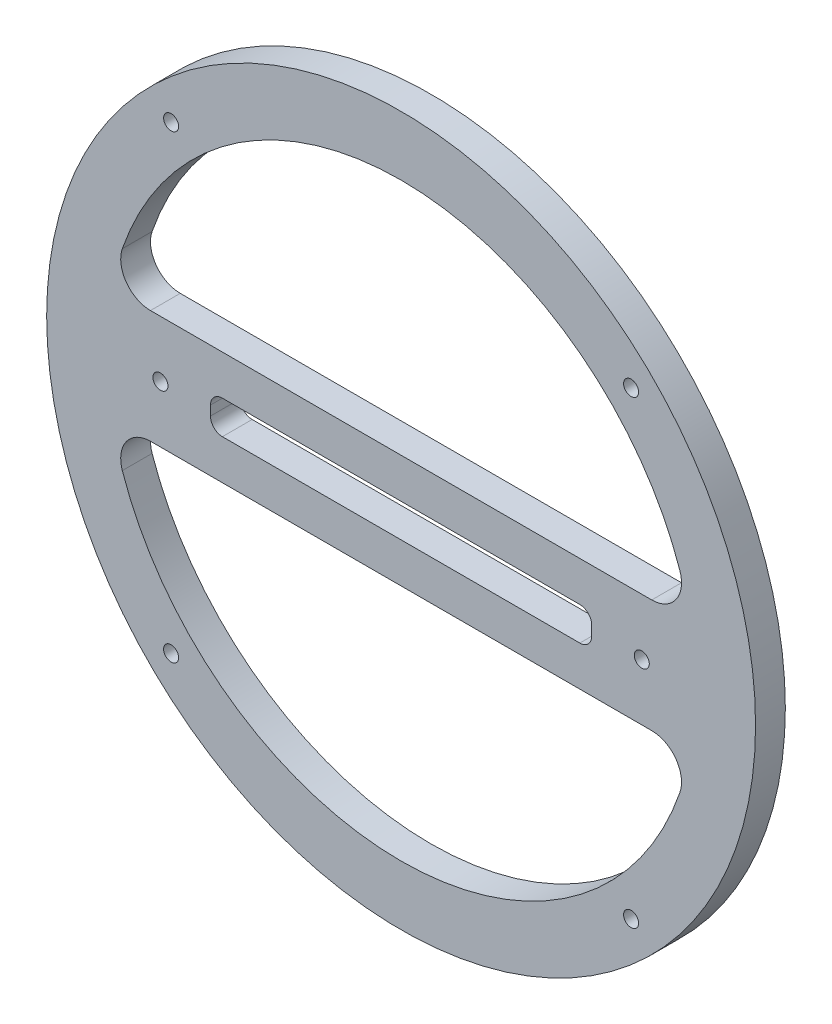
ISO-10303-21;
HEADER;
FILE_DESCRIPTION(('STEP AP214'),'2;1');
FILE_NAME('part.step','',(''),(''),'','','');
FILE_SCHEMA(('AUTOMOTIVE_DESIGN { 1 0 10303 214 1 1 1 1 }'));
ENDSEC;
DATA;
#1=APPLICATION_CONTEXT('core data for automotive mechanical design processes');
#2=APPLICATION_PROTOCOL_DEFINITION('international standard','automotive_design',2000,#1);
#3=PRODUCT_CONTEXT('',#1,'mechanical');
#4=PRODUCT('Part','Part','',(#3));
#5=PRODUCT_RELATED_PRODUCT_CATEGORY('part','',(#4));
#6=PRODUCT_DEFINITION_FORMATION('','',#4);
#7=PRODUCT_DEFINITION_CONTEXT('part definition',#1,'design');
#8=PRODUCT_DEFINITION('design','',#6,#7);
#9=PRODUCT_DEFINITION_SHAPE('','',#8);
#10=(LENGTH_UNIT() NAMED_UNIT(*) SI_UNIT(.MILLI.,.METRE.));
#11=(NAMED_UNIT(*) PLANE_ANGLE_UNIT() SI_UNIT($,.RADIAN.));
#12=(NAMED_UNIT(*) SI_UNIT($,.STERADIAN.) SOLID_ANGLE_UNIT());
#13=UNCERTAINTY_MEASURE_WITH_UNIT(LENGTH_MEASURE(1.E-05),#10,'distance_accuracy_value','');
#14=(GEOMETRIC_REPRESENTATION_CONTEXT(3) GLOBAL_UNCERTAINTY_ASSIGNED_CONTEXT((#13)) GLOBAL_UNIT_ASSIGNED_CONTEXT((#10,
#11,#12)) REPRESENTATION_CONTEXT('',''));
#15=CARTESIAN_POINT('',(0.,0.,0.));
#16=DIRECTION('',(0.,0.,1.));
#17=DIRECTION('',(1.,0.,0.));
#18=AXIS2_PLACEMENT_3D('',#15,#16,#17);
#19=CARTESIAN_POINT('',(0.,0.,-6.35));
#20=DIRECTION('',(0.,0.,1.));
#21=DIRECTION('',(1.,0.,0.));
#22=AXIS2_PLACEMENT_3D('',#19,#20,#21);
#23=CYLINDRICAL_SURFACE('',#22,75.565);
#24=CARTESIAN_POINT('',(0.,0.,-6.35));
#25=DIRECTION('',(0.,0.,1.));
#26=DIRECTION('',(1.,0.,0.));
#27=AXIS2_PLACEMENT_3D('',#24,#25,#26);
#28=CIRCLE('',#27,75.565);
#29=CARTESIAN_POINT('',(75.565,0.,-6.35));
#30=VERTEX_POINT('',#29);
#31=EDGE_CURVE('E11',#30,#30,#28,.T.);
#32=ORIENTED_EDGE('',*,*,#31,.T.);
#33=EDGE_LOOP('',(#32));
#34=FACE_BOUND('',#33,.T.);
#35=CARTESIAN_POINT('',(0.,0.,0.));
#36=DIRECTION('',(0.,0.,1.));
#37=DIRECTION('',(1.,0.,0.));
#38=AXIS2_PLACEMENT_3D('',#35,#36,#37);
#39=CIRCLE('',#38,75.565);
#40=CARTESIAN_POINT('',(75.565,0.,0.));
#41=VERTEX_POINT('',#40);
#42=EDGE_CURVE('E42',#41,#41,#39,.T.);
#43=ORIENTED_EDGE('',*,*,#42,.F.);
#44=EDGE_LOOP('',(#43));
#45=FACE_BOUND('',#44,.T.);
#46=ADVANCED_FACE('F39',(#34,#45),#23,.T.);
#47=CARTESIAN_POINT('',(0.,0.,-6.35));
#48=DIRECTION('',(0.,0.,1.));
#49=DIRECTION('',(1.,0.,0.));
#50=AXIS2_PLACEMENT_3D('',#47,#48,#49);
#51=PLANE('',#50);
#52=CARTESIAN_POINT('',(-49.0321984210441,49.0321984210295,-6.35));
#53=DIRECTION('',(0.,0.,1.));
#54=DIRECTION('',(1.,0.,0.));
#55=AXIS2_PLACEMENT_3D('',#52,#53,#54);
#56=CIRCLE('',#55,1.6);
#57=CARTESIAN_POINT('',(-47.4321984210441,49.0321984210295,-6.35));
#58=VERTEX_POINT('',#57);
#59=EDGE_CURVE('E460',#58,#58,#56,.T.);
#60=ORIENTED_EDGE('',*,*,#59,.T.);
#61=EDGE_LOOP('',(#60));
#62=FACE_BOUND('',#61,.T.);
#63=CARTESIAN_POINT('',(-49.0321984210294,-49.0321984210469,-6.35));
#64=DIRECTION('',(0.,0.,1.));
#65=DIRECTION('',(1.,0.,0.));
#66=AXIS2_PLACEMENT_3D('',#63,#64,#65);
#67=CIRCLE('',#66,1.6);
#68=CARTESIAN_POINT('',(-47.4321984210294,-49.0321984210469,-6.35));
#69=VERTEX_POINT('',#68);
#70=EDGE_CURVE('E469',#69,#69,#67,.T.);
#71=ORIENTED_EDGE('',*,*,#70,.T.);
#72=EDGE_LOOP('',(#71));
#73=FACE_BOUND('',#72,.T.);
#74=CARTESIAN_POINT('',(49.0321984210469,-49.0321984210322,-6.35));
#75=DIRECTION('',(0.,0.,1.));
#76=DIRECTION('',(1.,0.,0.));
#77=AXIS2_PLACEMENT_3D('',#74,#75,#76);
#78=CIRCLE('',#77,1.6);
#79=CARTESIAN_POINT('',(50.6321984210469,-49.0321984210322,-6.35));
#80=VERTEX_POINT('',#79);
#81=EDGE_CURVE('E477',#80,#80,#78,.T.);
#82=ORIENTED_EDGE('',*,*,#81,.T.);
#83=EDGE_LOOP('',(#82));
#84=FACE_BOUND('',#83,.T.);
#85=CARTESIAN_POINT('',(49.0321984210322,49.0321984210442,-6.35));
#86=DIRECTION('',(0.,0.,1.));
#87=DIRECTION('',(1.,0.,0.));
#88=AXIS2_PLACEMENT_3D('',#85,#86,#87);
#89=CIRCLE('',#88,1.6);
#90=CARTESIAN_POINT('',(50.6321984210322,49.0321984210442,-6.35));
#91=VERTEX_POINT('',#90);
#92=EDGE_CURVE('E485',#91,#91,#89,.T.);
#93=ORIENTED_EDGE('',*,*,#92,.T.);
#94=EDGE_LOOP('',(#93));
#95=FACE_BOUND('',#94,.T.);
#96=CARTESIAN_POINT('',(51.308,0.,-6.35));
#97=DIRECTION('',(0.,0.,1.));
#98=DIRECTION('',(-1.,0.,0.));
#99=AXIS2_PLACEMENT_3D('',#96,#97,#98);
#100=CIRCLE('',#99,1.6);
#101=CARTESIAN_POINT('',(49.708,0.,-6.35));
#102=VERTEX_POINT('',#101);
#103=EDGE_CURVE('E493',#102,#102,#100,.T.);
#104=ORIENTED_EDGE('',*,*,#103,.T.);
#105=EDGE_LOOP('',(#104));
#106=FACE_BOUND('',#105,.T.);
#107=CARTESIAN_POINT('',(-51.308,0.,-6.35));
#108=DIRECTION('',(0.,0.,1.));
#109=DIRECTION('',(1.,0.,0.));
#110=AXIS2_PLACEMENT_3D('',#107,#108,#109);
#111=CIRCLE('',#110,1.6);
#112=CARTESIAN_POINT('',(-49.708,0.,-6.35));
#113=VERTEX_POINT('',#112);
#114=EDGE_CURVE('E206',#113,#113,#111,.T.);
#115=ORIENTED_EDGE('',*,*,#114,.T.);
#116=EDGE_LOOP('',(#115));
#117=FACE_BOUND('',#116,.T.);
#118=DIRECTION('',(1.,0.,0.));
#119=VECTOR('',#118,1.);
#120=CARTESIAN_POINT('',(-38.1,-3.556,-6.35));
#121=LINE('',#120,#119);
#122=CARTESIAN_POINT('',(-38.1,-3.556,-6.35));
#123=VERTEX_POINT('',#122);
#124=CARTESIAN_POINT('',(38.1,-3.556,-6.35));
#125=VERTEX_POINT('',#124);
#126=EDGE_CURVE('E161',#123,#125,#121,.T.);
#127=ORIENTED_EDGE('',*,*,#126,.T.);
#128=CARTESIAN_POINT('',(38.1,-1.016,-6.35));
#129=DIRECTION('',(0.,0.,1.));
#130=DIRECTION('',(1.,0.,0.));
#131=AXIS2_PLACEMENT_3D('',#128,#129,#130);
#132=CIRCLE('',#131,2.54);
#133=CARTESIAN_POINT('',(40.64,-1.016,-6.35));
#134=VERTEX_POINT('',#133);
#135=EDGE_CURVE('E154',#125,#134,#132,.T.);
#136=ORIENTED_EDGE('',*,*,#135,.T.);
#137=DIRECTION('',(0.,1.,0.));
#138=VECTOR('',#137,1.);
#139=CARTESIAN_POINT('',(40.64,-1.016,-6.35));
#140=LINE('',#139,#138);
#141=CARTESIAN_POINT('',(40.64,1.016,-6.35));
#142=VERTEX_POINT('',#141);
#143=EDGE_CURVE('E164',#134,#142,#140,.T.);
#144=ORIENTED_EDGE('',*,*,#143,.T.);
#145=CARTESIAN_POINT('',(38.1,1.016,-6.35));
#146=DIRECTION('',(0.,0.,1.));
#147=DIRECTION('',(-1.,0.,0.));
#148=AXIS2_PLACEMENT_3D('',#145,#146,#147);
#149=CIRCLE('',#148,2.54);
#150=CARTESIAN_POINT('',(38.1,3.556,-6.35));
#151=VERTEX_POINT('',#150);
#152=EDGE_CURVE('E54',#142,#151,#149,.T.);
#153=ORIENTED_EDGE('',*,*,#152,.T.);
#154=DIRECTION('',(-1.,0.,0.));
#155=VECTOR('',#154,1.);
#156=CARTESIAN_POINT('',(-38.1,3.556,-6.35));
#157=LINE('',#156,#155);
#158=CARTESIAN_POINT('',(-38.1,3.556,-6.35));
#159=VERTEX_POINT('',#158);
#160=EDGE_CURVE('E186',#151,#159,#157,.T.);
#161=ORIENTED_EDGE('',*,*,#160,.T.);
#162=CARTESIAN_POINT('',(-38.1,1.016,-6.35));
#163=DIRECTION('',(0.,0.,1.));
#164=DIRECTION('',(-1.,0.,0.));
#165=AXIS2_PLACEMENT_3D('',#162,#163,#164);
#166=CIRCLE('',#165,2.54);
#167=CARTESIAN_POINT('',(-40.64,1.016,-6.35));
#168=VERTEX_POINT('',#167);
#169=EDGE_CURVE('E190',#159,#168,#166,.T.);
#170=ORIENTED_EDGE('',*,*,#169,.T.);
#171=DIRECTION('',(0.,-1.,0.));
#172=VECTOR('',#171,1.);
#173=CARTESIAN_POINT('',(-40.64,-1.016,-6.35));
#174=LINE('',#173,#172);
#175=CARTESIAN_POINT('',(-40.64,-1.016,-6.35));
#176=VERTEX_POINT('',#175);
#177=EDGE_CURVE('E194',#168,#176,#174,.T.);
#178=ORIENTED_EDGE('',*,*,#177,.T.);
#179=CARTESIAN_POINT('',(-38.1,-1.016,-6.35));
#180=DIRECTION('',(0.,0.,1.));
#181=DIRECTION('',(-1.,0.,0.));
#182=AXIS2_PLACEMENT_3D('',#179,#180,#181);
#183=CIRCLE('',#182,2.54);
#184=EDGE_CURVE('E198',#176,#123,#183,.T.);
#185=ORIENTED_EDGE('',*,*,#184,.T.);
#186=EDGE_LOOP('',(#127,#136,#144,#153,#161,#170,#178,#185));
#187=FACE_BOUND('',#186,.T.);
#188=DIRECTION('',(1.,0.,0.));
#189=VECTOR('',#188,1.);
#190=CARTESIAN_POINT('',(-53.4306372786251,12.065,-6.35));
#191=LINE('',#190,#189);
#192=CARTESIAN_POINT('',(-53.4306372786251,12.065,-6.35));
#193=VERTEX_POINT('',#192);
#194=CARTESIAN_POINT('',(53.4306372786251,12.065,-6.35));
#195=VERTEX_POINT('',#194);
#196=EDGE_CURVE('E262',#193,#195,#191,.T.);
#197=ORIENTED_EDGE('',*,*,#196,.T.);
#198=CARTESIAN_POINT('',(53.4306372786251,18.415,-6.35));
#199=DIRECTION('',(0.,0.,1.));
#200=DIRECTION('',(1.,0.,0.));
#201=AXIS2_PLACEMENT_3D('',#198,#199,#200);
#202=CIRCLE('',#201,6.35);
#203=CARTESIAN_POINT('',(59.4340796694818,20.4841011235955,-6.35));
#204=VERTEX_POINT('',#203);
#205=EDGE_CURVE('E249',#195,#204,#202,.T.);
#206=ORIENTED_EDGE('',*,*,#205,.T.);
#207=CARTESIAN_POINT('',(0.,0.,-6.35));
#208=DIRECTION('',(0.,0.,1.));
#209=DIRECTION('',(1.,0.,0.));
#210=AXIS2_PLACEMENT_3D('',#207,#208,#209);
#211=CIRCLE('',#210,62.865);
#212=CARTESIAN_POINT('',(-59.4340796694818,20.4841011235955,-6.35));
#213=VERTEX_POINT('',#212);
#214=EDGE_CURVE('E253',#204,#213,#211,.T.);
#215=ORIENTED_EDGE('',*,*,#214,.T.);
#216=CARTESIAN_POINT('',(-53.4306372786251,18.415,-6.35));
#217=DIRECTION('',(0.,0.,1.));
#218=DIRECTION('',(-1.,0.,0.));
#219=AXIS2_PLACEMENT_3D('',#216,#217,#218);
#220=CIRCLE('',#219,6.34999999999999);
#221=EDGE_CURVE('E258',#213,#193,#220,.T.);
#222=ORIENTED_EDGE('',*,*,#221,.T.);
#223=EDGE_LOOP('',(#197,#206,#215,#222));
#224=FACE_BOUND('',#223,.T.);
#225=DIRECTION('',(-1.,0.,0.));
#226=VECTOR('',#225,1.);
#227=CARTESIAN_POINT('',(-53.4306372786251,-12.065,-6.35));
#228=LINE('',#227,#226);
#229=CARTESIAN_POINT('',(53.4306372786251,-12.065,-6.35));
#230=VERTEX_POINT('',#229);
#231=CARTESIAN_POINT('',(-53.4306372786251,-12.065,-6.35));
#232=VERTEX_POINT('',#231);
#233=EDGE_CURVE('E306',#230,#232,#228,.T.);
#234=ORIENTED_EDGE('',*,*,#233,.T.);
#235=CARTESIAN_POINT('',(-53.4306372786251,-18.415,-6.35));
#236=DIRECTION('',(0.,0.,1.));
#237=DIRECTION('',(1.,0.,0.));
#238=AXIS2_PLACEMENT_3D('',#235,#236,#237);
#239=CIRCLE('',#238,6.34999999999999);
#240=CARTESIAN_POINT('',(-59.4340796694818,-20.4841011235955,-6.35));
#241=VERTEX_POINT('',#240);
#242=EDGE_CURVE('E293',#232,#241,#239,.T.);
#243=ORIENTED_EDGE('',*,*,#242,.T.);
#244=CARTESIAN_POINT('',(0.,0.,-6.35));
#245=DIRECTION('',(0.,0.,1.));
#246=DIRECTION('',(1.,0.,0.));
#247=AXIS2_PLACEMENT_3D('',#244,#245,#246);
#248=CIRCLE('',#247,62.865);
#249=CARTESIAN_POINT('',(59.4340796694818,-20.4841011235955,-6.35));
#250=VERTEX_POINT('',#249);
#251=EDGE_CURVE('E297',#241,#250,#248,.T.);
#252=ORIENTED_EDGE('',*,*,#251,.T.);
#253=CARTESIAN_POINT('',(53.4306372786251,-18.415,-6.35));
#254=DIRECTION('',(0.,0.,1.));
#255=DIRECTION('',(-1.,0.,0.));
#256=AXIS2_PLACEMENT_3D('',#253,#254,#255);
#257=CIRCLE('',#256,6.35);
#258=EDGE_CURVE('E302',#250,#230,#257,.T.);
#259=ORIENTED_EDGE('',*,*,#258,.T.);
#260=EDGE_LOOP('',(#234,#243,#252,#259));
#261=FACE_BOUND('',#260,.T.);
#262=ORIENTED_EDGE('',*,*,#31,.F.);
#263=EDGE_LOOP('',(#262));
#264=FACE_BOUND('',#263,.T.);
#265=ADVANCED_FACE('F169',(#62,#73,#84,#95,#106,#117,#187,#224,#261,#264),#51,.F.);
#266=CARTESIAN_POINT('',(0.,0.,0.));
#267=DIRECTION('',(0.,0.,1.));
#268=DIRECTION('',(1.,0.,0.));
#269=AXIS2_PLACEMENT_3D('',#266,#267,#268);
#270=PLANE('',#269);
#271=CARTESIAN_POINT('',(-49.0321984210441,49.0321984210295,0.));
#272=DIRECTION('',(0.,0.,1.));
#273=DIRECTION('',(1.,0.,0.));
#274=AXIS2_PLACEMENT_3D('',#271,#272,#273);
#275=CIRCLE('',#274,1.6);
#276=CARTESIAN_POINT('',(-47.4321984210441,49.0321984210295,0.));
#277=VERTEX_POINT('',#276);
#278=EDGE_CURVE('E462',#277,#277,#275,.T.);
#279=ORIENTED_EDGE('',*,*,#278,.F.);
#280=EDGE_LOOP('',(#279));
#281=FACE_BOUND('',#280,.T.);
#282=CARTESIAN_POINT('',(-49.0321984210294,-49.0321984210469,0.));
#283=DIRECTION('',(0.,0.,1.));
#284=DIRECTION('',(1.,0.,0.));
#285=AXIS2_PLACEMENT_3D('',#282,#283,#284);
#286=CIRCLE('',#285,1.6);
#287=CARTESIAN_POINT('',(-47.4321984210294,-49.0321984210469,0.));
#288=VERTEX_POINT('',#287);
#289=EDGE_CURVE('E466',#288,#288,#286,.T.);
#290=ORIENTED_EDGE('',*,*,#289,.F.);
#291=EDGE_LOOP('',(#290));
#292=FACE_BOUND('',#291,.T.);
#293=CARTESIAN_POINT('',(49.0321984210469,-49.0321984210322,0.));
#294=DIRECTION('',(0.,0.,1.));
#295=DIRECTION('',(1.,0.,0.));
#296=AXIS2_PLACEMENT_3D('',#293,#294,#295);
#297=CIRCLE('',#296,1.6);
#298=CARTESIAN_POINT('',(50.6321984210469,-49.0321984210322,0.));
#299=VERTEX_POINT('',#298);
#300=EDGE_CURVE('E473',#299,#299,#297,.T.);
#301=ORIENTED_EDGE('',*,*,#300,.F.);
#302=EDGE_LOOP('',(#301));
#303=FACE_BOUND('',#302,.T.);
#304=CARTESIAN_POINT('',(49.0321984210322,49.0321984210442,0.));
#305=DIRECTION('',(0.,0.,1.));
#306=DIRECTION('',(1.,0.,0.));
#307=AXIS2_PLACEMENT_3D('',#304,#305,#306);
#308=CIRCLE('',#307,1.6);
#309=CARTESIAN_POINT('',(50.6321984210322,49.0321984210442,0.));
#310=VERTEX_POINT('',#309);
#311=EDGE_CURVE('E481',#310,#310,#308,.T.);
#312=ORIENTED_EDGE('',*,*,#311,.F.);
#313=EDGE_LOOP('',(#312));
#314=FACE_BOUND('',#313,.T.);
#315=CARTESIAN_POINT('',(51.308,0.,0.));
#316=DIRECTION('',(0.,0.,1.));
#317=DIRECTION('',(-1.,0.,0.));
#318=AXIS2_PLACEMENT_3D('',#315,#316,#317);
#319=CIRCLE('',#318,1.6);
#320=CARTESIAN_POINT('',(49.708,0.,0.));
#321=VERTEX_POINT('',#320);
#322=EDGE_CURVE('E489',#321,#321,#319,.T.);
#323=ORIENTED_EDGE('',*,*,#322,.F.);
#324=EDGE_LOOP('',(#323));
#325=FACE_BOUND('',#324,.T.);
#326=CARTESIAN_POINT('',(-51.308,0.,0.));
#327=DIRECTION('',(0.,0.,1.));
#328=DIRECTION('',(1.,0.,0.));
#329=AXIS2_PLACEMENT_3D('',#326,#327,#328);
#330=CIRCLE('',#329,1.6);
#331=CARTESIAN_POINT('',(-49.708,0.,0.));
#332=VERTEX_POINT('',#331);
#333=EDGE_CURVE('E181',#332,#332,#330,.T.);
#334=ORIENTED_EDGE('',*,*,#333,.F.);
#335=EDGE_LOOP('',(#334));
#336=FACE_BOUND('',#335,.T.);
#337=CARTESIAN_POINT('',(38.1,-1.016,0.));
#338=DIRECTION('',(0.,0.,1.));
#339=DIRECTION('',(1.,0.,0.));
#340=AXIS2_PLACEMENT_3D('',#337,#338,#339);
#341=CIRCLE('',#340,2.54);
#342=CARTESIAN_POINT('',(38.1,-3.556,0.));
#343=VERTEX_POINT('',#342);
#344=CARTESIAN_POINT('',(40.64,-1.016,0.));
#345=VERTEX_POINT('',#344);
#346=EDGE_CURVE('E62',#343,#345,#341,.T.);
#347=ORIENTED_EDGE('',*,*,#346,.F.);
#348=DIRECTION('',(1.,0.,0.));
#349=VECTOR('',#348,1.);
#350=CARTESIAN_POINT('',(-38.1,-3.556,0.));
#351=LINE('',#350,#349);
#352=CARTESIAN_POINT('',(-38.1,-3.556,0.));
#353=VERTEX_POINT('',#352);
#354=EDGE_CURVE('E174',#353,#343,#351,.T.);
#355=ORIENTED_EDGE('',*,*,#354,.F.);
#356=CARTESIAN_POINT('',(-38.1,-1.016,0.));
#357=DIRECTION('',(0.,0.,1.));
#358=DIRECTION('',(-1.,0.,0.));
#359=AXIS2_PLACEMENT_3D('',#356,#357,#358);
#360=CIRCLE('',#359,2.54);
#361=CARTESIAN_POINT('',(-40.64,-1.016,0.));
#362=VERTEX_POINT('',#361);
#363=EDGE_CURVE('E178',#362,#353,#360,.T.);
#364=ORIENTED_EDGE('',*,*,#363,.F.);
#365=DIRECTION('',(0.,-1.,0.));
#366=VECTOR('',#365,1.);
#367=CARTESIAN_POINT('',(-40.64,-1.016,0.));
#368=LINE('',#367,#366);
#369=CARTESIAN_POINT('',(-40.64,1.016,0.));
#370=VERTEX_POINT('',#369);
#371=EDGE_CURVE('E221',#370,#362,#368,.T.);
#372=ORIENTED_EDGE('',*,*,#371,.F.);
#373=CARTESIAN_POINT('',(-38.1,1.016,0.));
#374=DIRECTION('',(0.,0.,1.));
#375=DIRECTION('',(-1.,0.,0.));
#376=AXIS2_PLACEMENT_3D('',#373,#374,#375);
#377=CIRCLE('',#376,2.54);
#378=CARTESIAN_POINT('',(-38.1,3.556,0.));
#379=VERTEX_POINT('',#378);
#380=EDGE_CURVE('E217',#379,#370,#377,.T.);
#381=ORIENTED_EDGE('',*,*,#380,.F.);
#382=DIRECTION('',(-1.,0.,0.));
#383=VECTOR('',#382,1.);
#384=CARTESIAN_POINT('',(-38.1,3.556,0.));
#385=LINE('',#384,#383);
#386=CARTESIAN_POINT('',(38.1,3.556,0.));
#387=VERTEX_POINT('',#386);
#388=EDGE_CURVE('E213',#387,#379,#385,.T.);
#389=ORIENTED_EDGE('',*,*,#388,.F.);
#390=CARTESIAN_POINT('',(38.1,1.016,0.));
#391=DIRECTION('',(0.,0.,1.));
#392=DIRECTION('',(-1.,0.,0.));
#393=AXIS2_PLACEMENT_3D('',#390,#391,#392);
#394=CIRCLE('',#393,2.54);
#395=CARTESIAN_POINT('',(40.64,1.016,0.));
#396=VERTEX_POINT('',#395);
#397=EDGE_CURVE('E209',#396,#387,#394,.T.);
#398=ORIENTED_EDGE('',*,*,#397,.F.);
#399=DIRECTION('',(0.,1.,0.));
#400=VECTOR('',#399,1.);
#401=CARTESIAN_POINT('',(40.64,-1.016,0.));
#402=LINE('',#401,#400);
#403=EDGE_CURVE('E205',#345,#396,#402,.T.);
#404=ORIENTED_EDGE('',*,*,#403,.F.);
#405=EDGE_LOOP('',(#347,#355,#364,#372,#381,#389,#398,#404));
#406=FACE_BOUND('',#405,.T.);
#407=CARTESIAN_POINT('',(53.4306372786251,18.415,0.));
#408=DIRECTION('',(0.,0.,1.));
#409=DIRECTION('',(1.,0.,0.));
#410=AXIS2_PLACEMENT_3D('',#407,#408,#409);
#411=CIRCLE('',#410,6.35);
#412=CARTESIAN_POINT('',(53.4306372786251,12.065,0.));
#413=VERTEX_POINT('',#412);
#414=CARTESIAN_POINT('',(59.4340796694818,20.4841011235955,0.));
#415=VERTEX_POINT('',#414);
#416=EDGE_CURVE('E231',#413,#415,#411,.T.);
#417=ORIENTED_EDGE('',*,*,#416,.F.);
#418=DIRECTION('',(1.,0.,0.));
#419=VECTOR('',#418,1.);
#420=CARTESIAN_POINT('',(-53.4306372786251,12.065,0.));
#421=LINE('',#420,#419);
#422=CARTESIAN_POINT('',(-53.4306372786251,12.065,0.));
#423=VERTEX_POINT('',#422);
#424=EDGE_CURVE('E254',#423,#413,#421,.T.);
#425=ORIENTED_EDGE('',*,*,#424,.F.);
#426=CARTESIAN_POINT('',(-53.4306372786251,18.415,0.));
#427=DIRECTION('',(0.,0.,1.));
#428=DIRECTION('',(-1.,0.,0.));
#429=AXIS2_PLACEMENT_3D('',#426,#427,#428);
#430=CIRCLE('',#429,6.34999999999999);
#431=CARTESIAN_POINT('',(-59.4340796694818,20.4841011235955,0.));
#432=VERTEX_POINT('',#431);
#433=EDGE_CURVE('E273',#432,#423,#430,.T.);
#434=ORIENTED_EDGE('',*,*,#433,.F.);
#435=CARTESIAN_POINT('',(0.,0.,0.));
#436=DIRECTION('',(0.,0.,1.));
#437=DIRECTION('',(1.,0.,0.));
#438=AXIS2_PLACEMENT_3D('',#435,#436,#437);
#439=CIRCLE('',#438,62.865);
#440=EDGE_CURVE('E269',#415,#432,#439,.T.);
#441=ORIENTED_EDGE('',*,*,#440,.F.);
#442=EDGE_LOOP('',(#417,#425,#434,#441));
#443=FACE_BOUND('',#442,.T.);
#444=CARTESIAN_POINT('',(-53.4306372786251,-18.415,0.));
#445=DIRECTION('',(0.,0.,1.));
#446=DIRECTION('',(1.,0.,0.));
#447=AXIS2_PLACEMENT_3D('',#444,#445,#446);
#448=CIRCLE('',#447,6.34999999999999);
#449=CARTESIAN_POINT('',(-53.4306372786251,-12.065,0.));
#450=VERTEX_POINT('',#449);
#451=CARTESIAN_POINT('',(-59.4340796694818,-20.4841011235955,0.));
#452=VERTEX_POINT('',#451);
#453=EDGE_CURVE('E283',#450,#452,#448,.T.);
#454=ORIENTED_EDGE('',*,*,#453,.F.);
#455=DIRECTION('',(-1.,0.,0.));
#456=VECTOR('',#455,1.);
#457=CARTESIAN_POINT('',(-53.4306372786251,-12.065,0.));
#458=LINE('',#457,#456);
#459=CARTESIAN_POINT('',(53.4306372786251,-12.065,0.));
#460=VERTEX_POINT('',#459);
#461=EDGE_CURVE('E298',#460,#450,#458,.T.);
#462=ORIENTED_EDGE('',*,*,#461,.F.);
#463=CARTESIAN_POINT('',(53.4306372786251,-18.415,0.));
#464=DIRECTION('',(0.,0.,1.));
#465=DIRECTION('',(-1.,0.,0.));
#466=AXIS2_PLACEMENT_3D('',#463,#464,#465);
#467=CIRCLE('',#466,6.35);
#468=CARTESIAN_POINT('',(59.4340796694818,-20.4841011235955,0.));
#469=VERTEX_POINT('',#468);
#470=EDGE_CURVE('E317',#469,#460,#467,.T.);
#471=ORIENTED_EDGE('',*,*,#470,.F.);
#472=CARTESIAN_POINT('',(0.,0.,0.));
#473=DIRECTION('',(0.,0.,1.));
#474=DIRECTION('',(1.,0.,0.));
#475=AXIS2_PLACEMENT_3D('',#472,#473,#474);
#476=CIRCLE('',#475,62.865);
#477=EDGE_CURVE('E313',#452,#469,#476,.T.);
#478=ORIENTED_EDGE('',*,*,#477,.F.);
#479=EDGE_LOOP('',(#454,#462,#471,#478));
#480=FACE_BOUND('',#479,.T.);
#481=ORIENTED_EDGE('',*,*,#42,.T.);
#482=EDGE_LOOP('',(#481));
#483=FACE_BOUND('',#482,.T.);
#484=ADVANCED_FACE('F345',(#281,#292,#303,#314,#325,#336,#406,#443,#480,#483),#270,.T.);
#485=CARTESIAN_POINT('',(-53.4306372786251,-18.415,-6.35));
#486=DIRECTION('',(0.,0.,1.));
#487=DIRECTION('',(1.,0.,0.));
#488=AXIS2_PLACEMENT_3D('',#485,#486,#487);
#489=CYLINDRICAL_SURFACE('',#488,6.34999999999999);
#490=ORIENTED_EDGE('',*,*,#453,.T.);
#491=DIRECTION('',(0.,0.,1.));
#492=VECTOR('',#491,1.);
#493=CARTESIAN_POINT('',(-59.4340796694818,-20.4841011235955,-6.35));
#494=LINE('',#493,#492);
#495=EDGE_CURVE('E310',#241,#452,#494,.T.);
#496=ORIENTED_EDGE('',*,*,#495,.F.);
#497=ORIENTED_EDGE('',*,*,#242,.F.);
#498=DIRECTION('',(0.,0.,1.));
#499=VECTOR('',#498,1.);
#500=CARTESIAN_POINT('',(-53.4306372786251,-12.065,-6.35));
#501=LINE('',#500,#499);
#502=EDGE_CURVE('E324',#232,#450,#501,.T.);
#503=ORIENTED_EDGE('',*,*,#502,.T.);
#504=EDGE_LOOP('',(#490,#496,#497,#503));
#505=FACE_BOUND('',#504,.T.);
#506=ADVANCED_FACE('F353',(#505),#489,.F.);
#507=CARTESIAN_POINT('',(-53.4306372786251,-12.065,-6.35));
#508=DIRECTION('',(0.,1.,0.));
#509=DIRECTION('',(0.,0.,1.));
#510=AXIS2_PLACEMENT_3D('',#507,#508,#509);
#511=PLANE('',#510);
#512=ORIENTED_EDGE('',*,*,#461,.T.);
#513=ORIENTED_EDGE('',*,*,#502,.F.);
#514=ORIENTED_EDGE('',*,*,#233,.F.);
#515=DIRECTION('',(0.,0.,1.));
#516=VECTOR('',#515,1.);
#517=CARTESIAN_POINT('',(53.4306372786251,-12.065,-6.35));
#518=LINE('',#517,#516);
#519=EDGE_CURVE('E327',#230,#460,#518,.T.);
#520=ORIENTED_EDGE('',*,*,#519,.T.);
#521=EDGE_LOOP('',(#512,#513,#514,#520));
#522=FACE_BOUND('',#521,.T.);
#523=ADVANCED_FACE('F355',(#522),#511,.F.);
#524=CARTESIAN_POINT('',(53.4306372786251,-18.415,-6.35));
#525=DIRECTION('',(0.,0.,1.));
#526=DIRECTION('',(1.,0.,0.));
#527=AXIS2_PLACEMENT_3D('',#524,#525,#526);
#528=CYLINDRICAL_SURFACE('',#527,6.35);
#529=ORIENTED_EDGE('',*,*,#470,.T.);
#530=ORIENTED_EDGE('',*,*,#519,.F.);
#531=ORIENTED_EDGE('',*,*,#258,.F.);
#532=DIRECTION('',(0.,0.,1.));
#533=VECTOR('',#532,1.);
#534=CARTESIAN_POINT('',(59.4340796694818,-20.4841011235955,-6.35));
#535=LINE('',#534,#533);
#536=EDGE_CURVE('E330',#250,#469,#535,.T.);
#537=ORIENTED_EDGE('',*,*,#536,.T.);
#538=EDGE_LOOP('',(#529,#530,#531,#537));
#539=FACE_BOUND('',#538,.T.);
#540=ADVANCED_FACE('F349',(#539),#528,.F.);
#541=CARTESIAN_POINT('',(0.,0.,-6.35));
#542=DIRECTION('',(0.,0.,1.));
#543=DIRECTION('',(1.,0.,0.));
#544=AXIS2_PLACEMENT_3D('',#541,#542,#543);
#545=CYLINDRICAL_SURFACE('',#544,62.865);
#546=ORIENTED_EDGE('',*,*,#477,.T.);
#547=ORIENTED_EDGE('',*,*,#536,.F.);
#548=ORIENTED_EDGE('',*,*,#251,.F.);
#549=ORIENTED_EDGE('',*,*,#495,.T.);
#550=EDGE_LOOP('',(#546,#547,#548,#549));
#551=FACE_BOUND('',#550,.T.);
#552=ADVANCED_FACE('F338',(#551),#545,.F.);
#553=CARTESIAN_POINT('',(53.4306372786251,18.415,-6.35));
#554=DIRECTION('',(0.,0.,1.));
#555=DIRECTION('',(1.,0.,0.));
#556=AXIS2_PLACEMENT_3D('',#553,#554,#555);
#557=CYLINDRICAL_SURFACE('',#556,6.35);
#558=ORIENTED_EDGE('',*,*,#416,.T.);
#559=DIRECTION('',(0.,0.,1.));
#560=VECTOR('',#559,1.);
#561=CARTESIAN_POINT('',(59.4340796694818,20.4841011235955,-6.35));
#562=LINE('',#561,#560);
#563=EDGE_CURVE('E266',#204,#415,#562,.T.);
#564=ORIENTED_EDGE('',*,*,#563,.F.);
#565=ORIENTED_EDGE('',*,*,#205,.F.);
#566=DIRECTION('',(0.,0.,1.));
#567=VECTOR('',#566,1.);
#568=CARTESIAN_POINT('',(53.4306372786251,12.065,-6.35));
#569=LINE('',#568,#567);
#570=EDGE_CURVE('E280',#195,#413,#569,.T.);
#571=ORIENTED_EDGE('',*,*,#570,.T.);
#572=EDGE_LOOP('',(#558,#564,#565,#571));
#573=FACE_BOUND('',#572,.T.);
#574=ADVANCED_FACE('F385',(#573),#557,.F.);
#575=CARTESIAN_POINT('',(-53.4306372786251,12.065,-6.35));
#576=DIRECTION('',(0.,-1.,0.));
#577=DIRECTION('',(0.,0.,-1.));
#578=AXIS2_PLACEMENT_3D('',#575,#576,#577);
#579=PLANE('',#578);
#580=ORIENTED_EDGE('',*,*,#424,.T.);
#581=ORIENTED_EDGE('',*,*,#570,.F.);
#582=ORIENTED_EDGE('',*,*,#196,.F.);
#583=DIRECTION('',(0.,0.,1.));
#584=VECTOR('',#583,1.);
#585=CARTESIAN_POINT('',(-53.4306372786251,12.065,-6.35));
#586=LINE('',#585,#584);
#587=EDGE_CURVE('E284',#193,#423,#586,.T.);
#588=ORIENTED_EDGE('',*,*,#587,.T.);
#589=EDGE_LOOP('',(#580,#581,#582,#588));
#590=FACE_BOUND('',#589,.T.);
#591=ADVANCED_FACE('F389',(#590),#579,.F.);
#592=CARTESIAN_POINT('',(-53.4306372786251,18.415,-6.35));
#593=DIRECTION('',(0.,0.,1.));
#594=DIRECTION('',(1.,0.,0.));
#595=AXIS2_PLACEMENT_3D('',#592,#593,#594);
#596=CYLINDRICAL_SURFACE('',#595,6.34999999999999);
#597=ORIENTED_EDGE('',*,*,#433,.T.);
#598=ORIENTED_EDGE('',*,*,#587,.F.);
#599=ORIENTED_EDGE('',*,*,#221,.F.);
#600=DIRECTION('',(0.,0.,1.));
#601=VECTOR('',#600,1.);
#602=CARTESIAN_POINT('',(-59.4340796694818,20.4841011235955,-6.35));
#603=LINE('',#602,#601);
#604=EDGE_CURVE('E287',#213,#432,#603,.T.);
#605=ORIENTED_EDGE('',*,*,#604,.T.);
#606=EDGE_LOOP('',(#597,#598,#599,#605));
#607=FACE_BOUND('',#606,.T.);
#608=ADVANCED_FACE('F394',(#607),#596,.F.);
#609=CARTESIAN_POINT('',(0.,0.,-6.35));
#610=DIRECTION('',(0.,0.,1.));
#611=DIRECTION('',(1.,0.,0.));
#612=AXIS2_PLACEMENT_3D('',#609,#610,#611);
#613=CYLINDRICAL_SURFACE('',#612,62.865);
#614=ORIENTED_EDGE('',*,*,#440,.T.);
#615=ORIENTED_EDGE('',*,*,#604,.F.);
#616=ORIENTED_EDGE('',*,*,#214,.F.);
#617=ORIENTED_EDGE('',*,*,#563,.T.);
#618=EDGE_LOOP('',(#614,#615,#616,#617));
#619=FACE_BOUND('',#618,.T.);
#620=ADVANCED_FACE('F398',(#619),#613,.F.);
#621=CARTESIAN_POINT('',(38.1,-1.016,-6.35));
#622=DIRECTION('',(0.,0.,1.));
#623=DIRECTION('',(1.,0.,0.));
#624=AXIS2_PLACEMENT_3D('',#621,#622,#623);
#625=CYLINDRICAL_SURFACE('',#624,2.54);
#626=ORIENTED_EDGE('',*,*,#346,.T.);
#627=DIRECTION('',(0.,0.,1.));
#628=VECTOR('',#627,1.);
#629=CARTESIAN_POINT('',(40.64,-1.016,-6.35));
#630=LINE('',#629,#628);
#631=EDGE_CURVE('E150',#134,#345,#630,.T.);
#632=ORIENTED_EDGE('',*,*,#631,.F.);
#633=ORIENTED_EDGE('',*,*,#135,.F.);
#634=DIRECTION('',(0.,0.,1.));
#635=VECTOR('',#634,1.);
#636=CARTESIAN_POINT('',(38.1,-3.556,-6.35));
#637=LINE('',#636,#635);
#638=EDGE_CURVE('E228',#125,#343,#637,.T.);
#639=ORIENTED_EDGE('',*,*,#638,.T.);
#640=EDGE_LOOP('',(#626,#632,#633,#639));
#641=FACE_BOUND('',#640,.T.);
#642=ADVANCED_FACE('F152',(#641),#625,.F.);
#643=CARTESIAN_POINT('',(-38.1,-3.556,-6.35));
#644=DIRECTION('',(0.,-1.,0.));
#645=DIRECTION('',(0.,0.,-1.));
#646=AXIS2_PLACEMENT_3D('',#643,#644,#645);
#647=PLANE('',#646);
#648=ORIENTED_EDGE('',*,*,#354,.T.);
#649=ORIENTED_EDGE('',*,*,#638,.F.);
#650=ORIENTED_EDGE('',*,*,#126,.F.);
#651=DIRECTION('',(0.,0.,1.));
#652=VECTOR('',#651,1.);
#653=CARTESIAN_POINT('',(-38.1,-3.556,-6.35));
#654=LINE('',#653,#652);
#655=EDGE_CURVE('E232',#123,#353,#654,.T.);
#656=ORIENTED_EDGE('',*,*,#655,.T.);
#657=EDGE_LOOP('',(#648,#649,#650,#656));
#658=FACE_BOUND('',#657,.T.);
#659=ADVANCED_FACE('F407',(#658),#647,.F.);
#660=CARTESIAN_POINT('',(-38.1,-1.016,-6.35));
#661=DIRECTION('',(0.,0.,1.));
#662=DIRECTION('',(1.,0.,0.));
#663=AXIS2_PLACEMENT_3D('',#660,#661,#662);
#664=CYLINDRICAL_SURFACE('',#663,2.54);
#665=ORIENTED_EDGE('',*,*,#363,.T.);
#666=ORIENTED_EDGE('',*,*,#655,.F.);
#667=ORIENTED_EDGE('',*,*,#184,.F.);
#668=DIRECTION('',(0.,0.,1.));
#669=VECTOR('',#668,1.);
#670=CARTESIAN_POINT('',(-40.64,-1.016,-6.35));
#671=LINE('',#670,#669);
#672=EDGE_CURVE('E235',#176,#362,#671,.T.);
#673=ORIENTED_EDGE('',*,*,#672,.T.);
#674=EDGE_LOOP('',(#665,#666,#667,#673));
#675=FACE_BOUND('',#674,.T.);
#676=ADVANCED_FACE('F425',(#675),#664,.F.);
#677=CARTESIAN_POINT('',(-40.64,-1.016,-6.35));
#678=DIRECTION('',(-1.,0.,0.));
#679=DIRECTION('',(0.,0.,1.));
#680=AXIS2_PLACEMENT_3D('',#677,#678,#679);
#681=PLANE('',#680);
#682=ORIENTED_EDGE('',*,*,#371,.T.);
#683=ORIENTED_EDGE('',*,*,#672,.F.);
#684=ORIENTED_EDGE('',*,*,#177,.F.);
#685=DIRECTION('',(0.,0.,1.));
#686=VECTOR('',#685,1.);
#687=CARTESIAN_POINT('',(-40.64,1.016,-6.35));
#688=LINE('',#687,#686);
#689=EDGE_CURVE('E238',#168,#370,#688,.T.);
#690=ORIENTED_EDGE('',*,*,#689,.T.);
#691=EDGE_LOOP('',(#682,#683,#684,#690));
#692=FACE_BOUND('',#691,.T.);
#693=ADVANCED_FACE('F421',(#692),#681,.F.);
#694=CARTESIAN_POINT('',(-38.1,1.016,-6.35));
#695=DIRECTION('',(0.,0.,1.));
#696=DIRECTION('',(1.,0.,0.));
#697=AXIS2_PLACEMENT_3D('',#694,#695,#696);
#698=CYLINDRICAL_SURFACE('',#697,2.54);
#699=ORIENTED_EDGE('',*,*,#380,.T.);
#700=ORIENTED_EDGE('',*,*,#689,.F.);
#701=ORIENTED_EDGE('',*,*,#169,.F.);
#702=DIRECTION('',(0.,0.,1.));
#703=VECTOR('',#702,1.);
#704=CARTESIAN_POINT('',(-38.1,3.556,-6.35));
#705=LINE('',#704,#703);
#706=EDGE_CURVE('E241',#159,#379,#705,.T.);
#707=ORIENTED_EDGE('',*,*,#706,.T.);
#708=EDGE_LOOP('',(#699,#700,#701,#707));
#709=FACE_BOUND('',#708,.T.);
#710=ADVANCED_FACE('F417',(#709),#698,.F.);
#711=CARTESIAN_POINT('',(-38.1,3.556,-6.35));
#712=DIRECTION('',(0.,1.,0.));
#713=DIRECTION('',(0.,0.,1.));
#714=AXIS2_PLACEMENT_3D('',#711,#712,#713);
#715=PLANE('',#714);
#716=ORIENTED_EDGE('',*,*,#388,.T.);
#717=ORIENTED_EDGE('',*,*,#706,.F.);
#718=ORIENTED_EDGE('',*,*,#160,.F.);
#719=DIRECTION('',(0.,0.,1.));
#720=VECTOR('',#719,1.);
#721=CARTESIAN_POINT('',(38.1,3.556,-6.35));
#722=LINE('',#721,#720);
#723=EDGE_CURVE('E244',#151,#387,#722,.T.);
#724=ORIENTED_EDGE('',*,*,#723,.T.);
#725=EDGE_LOOP('',(#716,#717,#718,#724));
#726=FACE_BOUND('',#725,.T.);
#727=ADVANCED_FACE('F414',(#726),#715,.F.);
#728=CARTESIAN_POINT('',(38.1,1.016,-6.35));
#729=DIRECTION('',(0.,0.,1.));
#730=DIRECTION('',(1.,0.,0.));
#731=AXIS2_PLACEMENT_3D('',#728,#729,#730);
#732=CYLINDRICAL_SURFACE('',#731,2.54);
#733=ORIENTED_EDGE('',*,*,#397,.T.);
#734=ORIENTED_EDGE('',*,*,#723,.F.);
#735=ORIENTED_EDGE('',*,*,#152,.F.);
#736=DIRECTION('',(0.,0.,1.));
#737=VECTOR('',#736,1.);
#738=CARTESIAN_POINT('',(40.64,1.016,-6.35));
#739=LINE('',#738,#737);
#740=EDGE_CURVE('E160',#142,#396,#739,.T.);
#741=ORIENTED_EDGE('',*,*,#740,.T.);
#742=EDGE_LOOP('',(#733,#734,#735,#741));
#743=FACE_BOUND('',#742,.T.);
#744=ADVANCED_FACE('F411',(#743),#732,.F.);
#745=CARTESIAN_POINT('',(40.64,-1.016,-6.35));
#746=DIRECTION('',(1.,0.,0.));
#747=DIRECTION('',(0.,0.,-1.));
#748=AXIS2_PLACEMENT_3D('',#745,#746,#747);
#749=PLANE('',#748);
#750=ORIENTED_EDGE('',*,*,#403,.T.);
#751=ORIENTED_EDGE('',*,*,#740,.F.);
#752=ORIENTED_EDGE('',*,*,#143,.F.);
#753=ORIENTED_EDGE('',*,*,#631,.T.);
#754=EDGE_LOOP('',(#750,#751,#752,#753));
#755=FACE_BOUND('',#754,.T.);
#756=ADVANCED_FACE('F165',(#755),#749,.F.);
#757=CARTESIAN_POINT('',(-51.308,0.,-6.35));
#758=DIRECTION('',(0.,0.,1.));
#759=DIRECTION('',(1.,0.,0.));
#760=AXIS2_PLACEMENT_3D('',#757,#758,#759);
#761=CYLINDRICAL_SURFACE('',#760,1.6);
#762=ORIENTED_EDGE('',*,*,#114,.F.);
#763=EDGE_LOOP('',(#762));
#764=FACE_BOUND('',#763,.T.);
#765=ORIENTED_EDGE('',*,*,#333,.T.);
#766=EDGE_LOOP('',(#765));
#767=FACE_BOUND('',#766,.T.);
#768=ADVANCED_FACE('F410',(#764,#767),#761,.F.);
#769=CARTESIAN_POINT('',(51.308,0.,-6.35));
#770=DIRECTION('',(0.,0.,1.));
#771=DIRECTION('',(1.,0.,0.));
#772=AXIS2_PLACEMENT_3D('',#769,#770,#771);
#773=CYLINDRICAL_SURFACE('',#772,1.6);
#774=ORIENTED_EDGE('',*,*,#103,.F.);
#775=EDGE_LOOP('',(#774));
#776=FACE_BOUND('',#775,.T.);
#777=ORIENTED_EDGE('',*,*,#322,.T.);
#778=EDGE_LOOP('',(#777));
#779=FACE_BOUND('',#778,.T.);
#780=ADVANCED_FACE('F435',(#776,#779),#773,.F.);
#781=CARTESIAN_POINT('',(49.0321984210322,49.0321984210442,-6.35));
#782=DIRECTION('',(0.,0.,1.));
#783=DIRECTION('',(1.,0.,0.));
#784=AXIS2_PLACEMENT_3D('',#781,#782,#783);
#785=CYLINDRICAL_SURFACE('',#784,1.6);
#786=ORIENTED_EDGE('',*,*,#92,.F.);
#787=EDGE_LOOP('',(#786));
#788=FACE_BOUND('',#787,.T.);
#789=ORIENTED_EDGE('',*,*,#311,.T.);
#790=EDGE_LOOP('',(#789));
#791=FACE_BOUND('',#790,.T.);
#792=ADVANCED_FACE('F439',(#788,#791),#785,.F.);
#793=CARTESIAN_POINT('',(49.0321984210469,-49.0321984210322,-6.35));
#794=DIRECTION('',(0.,0.,1.));
#795=DIRECTION('',(1.,0.,0.));
#796=AXIS2_PLACEMENT_3D('',#793,#794,#795);
#797=CYLINDRICAL_SURFACE('',#796,1.6);
#798=ORIENTED_EDGE('',*,*,#81,.F.);
#799=EDGE_LOOP('',(#798));
#800=FACE_BOUND('',#799,.T.);
#801=ORIENTED_EDGE('',*,*,#300,.T.);
#802=EDGE_LOOP('',(#801));
#803=FACE_BOUND('',#802,.T.);
#804=ADVANCED_FACE('F443',(#800,#803),#797,.F.);
#805=CARTESIAN_POINT('',(-49.0321984210294,-49.0321984210469,-6.35));
#806=DIRECTION('',(0.,0.,1.));
#807=DIRECTION('',(1.,0.,0.));
#808=AXIS2_PLACEMENT_3D('',#805,#806,#807);
#809=CYLINDRICAL_SURFACE('',#808,1.6);
#810=ORIENTED_EDGE('',*,*,#70,.F.);
#811=EDGE_LOOP('',(#810));
#812=FACE_BOUND('',#811,.T.);
#813=ORIENTED_EDGE('',*,*,#289,.T.);
#814=EDGE_LOOP('',(#813));
#815=FACE_BOUND('',#814,.T.);
#816=ADVANCED_FACE('F447',(#812,#815),#809,.F.);
#817=CARTESIAN_POINT('',(-49.0321984210441,49.0321984210295,-6.35));
#818=DIRECTION('',(0.,0.,1.));
#819=DIRECTION('',(1.,0.,0.));
#820=AXIS2_PLACEMENT_3D('',#817,#818,#819);
#821=CYLINDRICAL_SURFACE('',#820,1.6);
#822=ORIENTED_EDGE('',*,*,#59,.F.);
#823=EDGE_LOOP('',(#822));
#824=FACE_BOUND('',#823,.T.);
#825=ORIENTED_EDGE('',*,*,#278,.T.);
#826=EDGE_LOOP('',(#825));
#827=FACE_BOUND('',#826,.T.);
#828=ADVANCED_FACE('F451',(#824,#827),#821,.F.);
#829=CLOSED_SHELL('',(#46,#265,#484,#506,#523,#540,#552,#574,#591,#608,#620,#642,#659,#676,#693,
#710,#727,#744,#756,#768,#780,#792,#804,#816,#828));
#830=MANIFOLD_SOLID_BREP('B2',#829);
#831=ADVANCED_BREP_SHAPE_REPRESENTATION('',(#18,#830),#14);
#832=SHAPE_DEFINITION_REPRESENTATION(#9,#831);
ENDSEC;
END-ISO-10303-21;
